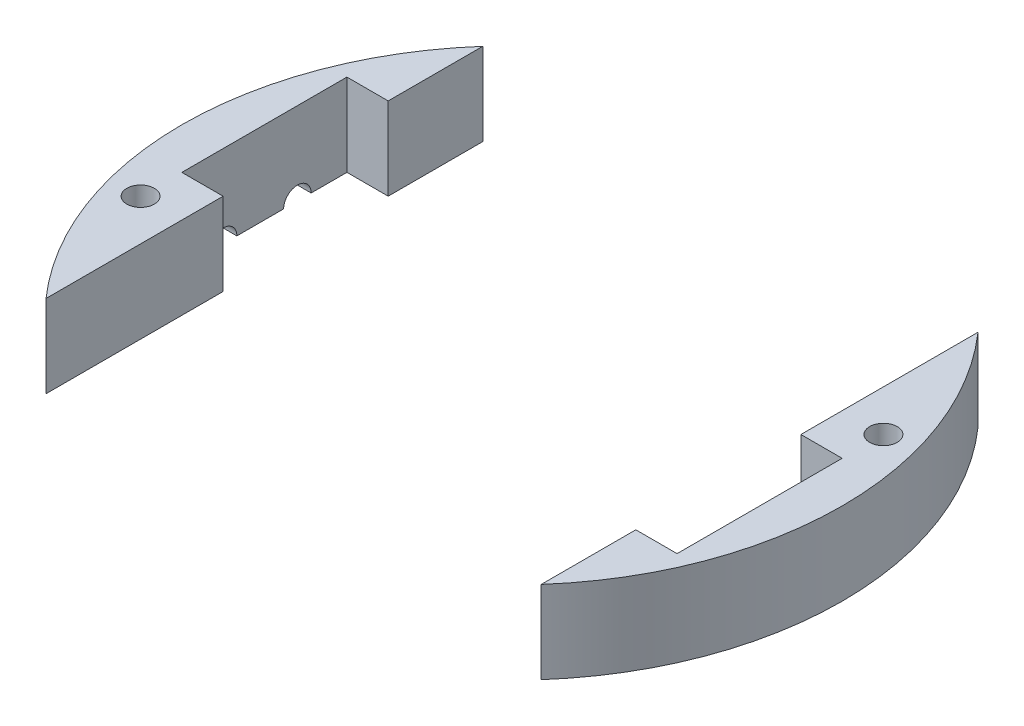
ISO-10303-21;
HEADER;
FILE_DESCRIPTION(('STEP AP214'),'2;1');
FILE_NAME('part.step','',(''),(''),'','','');
FILE_SCHEMA(('AUTOMOTIVE_DESIGN { 1 0 10303 214 1 1 1 1 }'));
ENDSEC;
DATA;
#1=APPLICATION_CONTEXT('core data for automotive mechanical design processes');
#2=APPLICATION_PROTOCOL_DEFINITION('international standard','automotive_design',2000,#1);
#3=PRODUCT_CONTEXT('',#1,'mechanical');
#4=PRODUCT('Part','Part','',(#3));
#5=PRODUCT_RELATED_PRODUCT_CATEGORY('part','',(#4));
#6=PRODUCT_DEFINITION_FORMATION('','',#4);
#7=PRODUCT_DEFINITION_CONTEXT('part definition',#1,'design');
#8=PRODUCT_DEFINITION('design','',#6,#7);
#9=PRODUCT_DEFINITION_SHAPE('','',#8);
#10=(LENGTH_UNIT() NAMED_UNIT(*) SI_UNIT(.MILLI.,.METRE.));
#11=(NAMED_UNIT(*) PLANE_ANGLE_UNIT() SI_UNIT($,.RADIAN.));
#12=(NAMED_UNIT(*) SI_UNIT($,.STERADIAN.) SOLID_ANGLE_UNIT());
#13=UNCERTAINTY_MEASURE_WITH_UNIT(LENGTH_MEASURE(1.E-05),#10,'distance_accuracy_value','');
#14=(GEOMETRIC_REPRESENTATION_CONTEXT(3) GLOBAL_UNCERTAINTY_ASSIGNED_CONTEXT((#13)) GLOBAL_UNIT_ASSIGNED_CONTEXT((#10,
#11,#12)) REPRESENTATION_CONTEXT('',''));
#15=CARTESIAN_POINT('',(0.,0.,0.));
#16=DIRECTION('',(0.,0.,1.));
#17=DIRECTION('',(1.,0.,0.));
#18=AXIS2_PLACEMENT_3D('',#15,#16,#17);
#19=CARTESIAN_POINT('',(45.,15.,22.5));
#20=DIRECTION('',(0.,0.,1.));
#21=DIRECTION('',(1.,0.,0.));
#22=AXIS2_PLACEMENT_3D('',#19,#20,#21);
#23=PLANE('',#22);
#24=DIRECTION('',(-1.,0.,0.));
#25=VECTOR('',#24,1.);
#26=CARTESIAN_POINT('',(45.,0.,22.5));
#27=LINE('',#26,#25);
#28=CARTESIAN_POINT('',(52.5,0.,22.5));
#29=VERTEX_POINT('',#28);
#30=CARTESIAN_POINT('',(45.,0.,22.5));
#31=VERTEX_POINT('',#30);
#32=EDGE_CURVE('E151',#29,#31,#27,.T.);
#33=ORIENTED_EDGE('',*,*,#32,.T.);
#34=DIRECTION('',(0.,-1.,0.));
#35=VECTOR('',#34,1.);
#36=CARTESIAN_POINT('',(45.,15.,22.5));
#37=LINE('',#36,#35);
#38=CARTESIAN_POINT('',(45.,15.,22.5));
#39=VERTEX_POINT('',#38);
#40=EDGE_CURVE('E207',#39,#31,#37,.T.);
#41=ORIENTED_EDGE('',*,*,#40,.F.);
#42=DIRECTION('',(-1.,0.,0.));
#43=VECTOR('',#42,1.);
#44=CARTESIAN_POINT('',(45.,15.,22.5));
#45=LINE('',#44,#43);
#46=CARTESIAN_POINT('',(52.5,15.,22.5));
#47=VERTEX_POINT('',#46);
#48=EDGE_CURVE('E157',#47,#39,#45,.T.);
#49=ORIENTED_EDGE('',*,*,#48,.F.);
#50=DIRECTION('',(0.,-1.,0.));
#51=VECTOR('',#50,1.);
#52=CARTESIAN_POINT('',(52.5,15.,22.5));
#53=LINE('',#52,#51);
#54=EDGE_CURVE('E202',#47,#29,#53,.T.);
#55=ORIENTED_EDGE('',*,*,#54,.T.);
#56=EDGE_LOOP('',(#33,#41,#49,#55));
#57=FACE_BOUND('',#56,.T.);
#58=ADVANCED_FACE('F55',(#57),#23,.F.);
#59=CARTESIAN_POINT('',(45.,15.,22.5));
#60=DIRECTION('',(1.,0.,0.));
#61=DIRECTION('',(0.,0.,-1.));
#62=AXIS2_PLACEMENT_3D('',#59,#60,#61);
#63=PLANE('',#62);
#64=DIRECTION('',(0.,0.,1.));
#65=VECTOR('',#64,1.);
#66=CARTESIAN_POINT('',(45.,0.,22.5));
#67=LINE('',#66,#65);
#68=CARTESIAN_POINT('',(45.,0.,39.6862696659689));
#69=VERTEX_POINT('',#68);
#70=EDGE_CURVE('E174',#31,#69,#67,.T.);
#71=ORIENTED_EDGE('',*,*,#70,.T.);
#72=DIRECTION('',(0.,-1.,0.));
#73=VECTOR('',#72,1.);
#74=CARTESIAN_POINT('',(45.,15.,39.6862696659689));
#75=LINE('',#74,#73);
#76=CARTESIAN_POINT('',(45.,15.,39.6862696659689));
#77=VERTEX_POINT('',#76);
#78=EDGE_CURVE('E210',#77,#69,#75,.T.);
#79=ORIENTED_EDGE('',*,*,#78,.F.);
#80=DIRECTION('',(0.,0.,1.));
#81=VECTOR('',#80,1.);
#82=CARTESIAN_POINT('',(45.,15.,22.5));
#83=LINE('',#82,#81);
#84=EDGE_CURVE('E186',#39,#77,#83,.T.);
#85=ORIENTED_EDGE('',*,*,#84,.F.);
#86=ORIENTED_EDGE('',*,*,#40,.T.);
#87=EDGE_LOOP('',(#71,#79,#85,#86));
#88=FACE_BOUND('',#87,.T.);
#89=ADVANCED_FACE('F233',(#88),#63,.F.);
#90=CARTESIAN_POINT('',(0.,15.,0.));
#91=DIRECTION('',(0.,-1.,0.));
#92=DIRECTION('',(0.,0.,-1.));
#93=AXIS2_PLACEMENT_3D('',#90,#91,#92);
#94=CYLINDRICAL_SURFACE('',#93,60.);
#95=CARTESIAN_POINT('',(0.,0.,0.));
#96=DIRECTION('',(0.,1.,0.));
#97=DIRECTION('',(0.,0.,1.));
#98=AXIS2_PLACEMENT_3D('',#95,#96,#97);
#99=CIRCLE('',#98,60.);
#100=CARTESIAN_POINT('',(45.,0.,-39.6862696659689));
#101=VERTEX_POINT('',#100);
#102=EDGE_CURVE('E170',#69,#101,#99,.T.);
#103=ORIENTED_EDGE('',*,*,#102,.T.);
#104=DIRECTION('',(0.,-1.,0.));
#105=VECTOR('',#104,1.);
#106=CARTESIAN_POINT('',(45.,15.,-39.6862696659689));
#107=LINE('',#106,#105);
#108=CARTESIAN_POINT('',(45.,15.,-39.6862696659689));
#109=VERTEX_POINT('',#108);
#110=EDGE_CURVE('E213',#109,#101,#107,.T.);
#111=ORIENTED_EDGE('',*,*,#110,.F.);
#112=CARTESIAN_POINT('',(0.,15.,0.));
#113=DIRECTION('',(0.,1.,0.));
#114=DIRECTION('',(0.,0.,1.));
#115=AXIS2_PLACEMENT_3D('',#112,#113,#114);
#116=CIRCLE('',#115,60.);
#117=EDGE_CURVE('E184',#77,#109,#116,.T.);
#118=ORIENTED_EDGE('',*,*,#117,.F.);
#119=ORIENTED_EDGE('',*,*,#78,.T.);
#120=EDGE_LOOP('',(#103,#111,#118,#119));
#121=FACE_BOUND('',#120,.T.);
#122=ADVANCED_FACE('F231',(#121),#94,.T.);
#123=CARTESIAN_POINT('',(45.,15.,-7.5));
#124=DIRECTION('',(1.,0.,0.));
#125=DIRECTION('',(0.,0.,-1.));
#126=AXIS2_PLACEMENT_3D('',#123,#124,#125);
#127=PLANE('',#126);
#128=DIRECTION('',(0.,0.,1.));
#129=VECTOR('',#128,1.);
#130=CARTESIAN_POINT('',(45.,0.,-7.5));
#131=LINE('',#130,#129);
#132=CARTESIAN_POINT('',(45.,0.,-7.5));
#133=VERTEX_POINT('',#132);
#134=EDGE_CURVE('E165',#101,#133,#131,.T.);
#135=ORIENTED_EDGE('',*,*,#134,.T.);
#136=DIRECTION('',(0.,-1.,0.));
#137=VECTOR('',#136,1.);
#138=CARTESIAN_POINT('',(45.,15.,-7.5));
#139=LINE('',#138,#137);
#140=CARTESIAN_POINT('',(45.,15.,-7.5));
#141=VERTEX_POINT('',#140);
#142=EDGE_CURVE('E216',#141,#133,#139,.T.);
#143=ORIENTED_EDGE('',*,*,#142,.F.);
#144=DIRECTION('',(0.,0.,1.));
#145=VECTOR('',#144,1.);
#146=CARTESIAN_POINT('',(45.,15.,-7.5));
#147=LINE('',#146,#145);
#148=EDGE_CURVE('E181',#109,#141,#147,.T.);
#149=ORIENTED_EDGE('',*,*,#148,.F.);
#150=ORIENTED_EDGE('',*,*,#110,.T.);
#151=EDGE_LOOP('',(#135,#143,#149,#150));
#152=FACE_BOUND('',#151,.T.);
#153=ADVANCED_FACE('F222',(#152),#127,.F.);
#154=CARTESIAN_POINT('',(45.,15.,-7.5));
#155=DIRECTION('',(0.,0.,-1.));
#156=DIRECTION('',(-1.,0.,0.));
#157=AXIS2_PLACEMENT_3D('',#154,#155,#156);
#158=PLANE('',#157);
#159=DIRECTION('',(1.,0.,0.));
#160=VECTOR('',#159,1.);
#161=CARTESIAN_POINT('',(45.,0.,-7.5));
#162=LINE('',#161,#160);
#163=CARTESIAN_POINT('',(52.5,0.,-7.5));
#164=VERTEX_POINT('',#163);
#165=EDGE_CURVE('E162',#133,#164,#162,.T.);
#166=ORIENTED_EDGE('',*,*,#165,.T.);
#167=DIRECTION('',(0.,-1.,0.));
#168=VECTOR('',#167,1.);
#169=CARTESIAN_POINT('',(52.5,15.,-7.5));
#170=LINE('',#169,#168);
#171=CARTESIAN_POINT('',(52.5,15.,-7.5));
#172=VERTEX_POINT('',#171);
#173=EDGE_CURVE('E182',#172,#164,#170,.T.);
#174=ORIENTED_EDGE('',*,*,#173,.F.);
#175=DIRECTION('',(1.,0.,0.));
#176=VECTOR('',#175,1.);
#177=CARTESIAN_POINT('',(45.,15.,-7.5));
#178=LINE('',#177,#176);
#179=EDGE_CURVE('E178',#141,#172,#178,.T.);
#180=ORIENTED_EDGE('',*,*,#179,.F.);
#181=ORIENTED_EDGE('',*,*,#142,.T.);
#182=EDGE_LOOP('',(#166,#174,#180,#181));
#183=FACE_BOUND('',#182,.T.);
#184=ADVANCED_FACE('F225',(#183),#158,.F.);
#185=CARTESIAN_POINT('',(52.5,15.,-7.5));
#186=DIRECTION('',(1.,0.,0.));
#187=DIRECTION('',(0.,0.,-1.));
#188=AXIS2_PLACEMENT_3D('',#185,#186,#187);
#189=PLANE('',#188);
#190=DIRECTION('',(0.,0.,1.));
#191=VECTOR('',#190,1.);
#192=CARTESIAN_POINT('',(52.5,0.,-7.5));
#193=LINE('',#192,#191);
#194=CARTESIAN_POINT('',(52.5,0.,2.5));
#195=VERTEX_POINT('',#194);
#196=CARTESIAN_POINT('',(52.5,0.,11.));
#197=VERTEX_POINT('',#196);
#198=EDGE_CURVE('E146',#195,#197,#193,.T.);
#199=ORIENTED_EDGE('',*,*,#198,.T.);
#200=CARTESIAN_POINT('',(52.5,0.,13.5));
#201=DIRECTION('',(-1.,0.,0.));
#202=DIRECTION('',(0.,0.,1.));
#203=AXIS2_PLACEMENT_3D('',#200,#201,#202);
#204=CIRCLE('',#203,2.5);
#205=CARTESIAN_POINT('',(52.5,0.,16.));
#206=VERTEX_POINT('',#205);
#207=EDGE_CURVE('E133',#206,#197,#204,.T.);
#208=ORIENTED_EDGE('',*,*,#207,.F.);
#209=EDGE_CURVE('E142',#206,#29,#193,.T.);
#210=ORIENTED_EDGE('',*,*,#209,.T.);
#211=ORIENTED_EDGE('',*,*,#54,.F.);
#212=DIRECTION('',(0.,0.,1.));
#213=VECTOR('',#212,1.);
#214=CARTESIAN_POINT('',(52.5,15.,7.5));
#215=LINE('',#214,#213);
#216=EDGE_CURVE('E153',#172,#47,#215,.T.);
#217=ORIENTED_EDGE('',*,*,#216,.F.);
#218=ORIENTED_EDGE('',*,*,#173,.T.);
#219=CARTESIAN_POINT('',(52.5,0.,-2.5));
#220=VERTEX_POINT('',#219);
#221=EDGE_CURVE('E155',#164,#220,#193,.T.);
#222=ORIENTED_EDGE('',*,*,#221,.T.);
#223=CARTESIAN_POINT('',(52.5,0.,0.));
#224=DIRECTION('',(-1.,0.,0.));
#225=DIRECTION('',(0.,0.,1.));
#226=AXIS2_PLACEMENT_3D('',#223,#224,#225);
#227=CIRCLE('',#226,2.5);
#228=EDGE_CURVE('E200',#195,#220,#227,.T.);
#229=ORIENTED_EDGE('',*,*,#228,.F.);
#230=EDGE_LOOP('',(#199,#208,#210,#211,#217,#218,#222,#229));
#231=FACE_BOUND('',#230,.T.);
#232=ADVANCED_FACE('F140',(#231),#189,.F.);
#233=CARTESIAN_POINT('',(0.,15.,0.));
#234=DIRECTION('',(0.,1.,0.));
#235=DIRECTION('',(0.,0.,1.));
#236=AXIS2_PLACEMENT_3D('',#233,#234,#235);
#237=PLANE('',#236);
#238=CARTESIAN_POINT('',(52.5,15.,-15.));
#239=DIRECTION('',(0.,1.,0.));
#240=DIRECTION('',(0.,0.,1.));
#241=AXIS2_PLACEMENT_3D('',#238,#239,#240);
#242=CIRCLE('',#241,2.5);
#243=CARTESIAN_POINT('',(52.5,15.,-12.5));
#244=VERTEX_POINT('',#243);
#245=EDGE_CURVE('E264',#244,#244,#242,.T.);
#246=ORIENTED_EDGE('',*,*,#245,.F.);
#247=EDGE_LOOP('',(#246));
#248=FACE_BOUND('',#247,.T.);
#249=ORIENTED_EDGE('',*,*,#216,.T.);
#250=ORIENTED_EDGE('',*,*,#48,.T.);
#251=ORIENTED_EDGE('',*,*,#84,.T.);
#252=ORIENTED_EDGE('',*,*,#117,.T.);
#253=ORIENTED_EDGE('',*,*,#148,.T.);
#254=ORIENTED_EDGE('',*,*,#179,.T.);
#255=EDGE_LOOP('',(#249,#250,#251,#252,#253,#254));
#256=FACE_BOUND('',#255,.T.);
#257=ADVANCED_FACE('F57',(#248,#256),#237,.T.);
#258=CARTESIAN_POINT('',(0.,0.,0.));
#259=DIRECTION('',(0.,1.,0.));
#260=DIRECTION('',(0.,0.,1.));
#261=AXIS2_PLACEMENT_3D('',#258,#259,#260);
#262=PLANE('',#261);
#263=CARTESIAN_POINT('',(52.5,0.,-15.));
#264=DIRECTION('',(0.,1.,0.));
#265=DIRECTION('',(0.,0.,1.));
#266=AXIS2_PLACEMENT_3D('',#263,#264,#265);
#267=CIRCLE('',#266,2.5);
#268=CARTESIAN_POINT('',(52.5,0.,-12.5));
#269=VERTEX_POINT('',#268);
#270=EDGE_CURVE('E147',#269,#269,#267,.T.);
#271=ORIENTED_EDGE('',*,*,#270,.T.);
#272=EDGE_LOOP('',(#271));
#273=FACE_BOUND('',#272,.T.);
#274=DIRECTION('',(0.,0.,1.));
#275=VECTOR('',#274,1.);
#276=CARTESIAN_POINT('',(55.,0.,0.));
#277=LINE('',#276,#275);
#278=CARTESIAN_POINT('',(55.,0.,11.));
#279=VERTEX_POINT('',#278);
#280=CARTESIAN_POINT('',(55.,0.,16.));
#281=VERTEX_POINT('',#280);
#282=EDGE_CURVE('E137',#279,#281,#277,.T.);
#283=ORIENTED_EDGE('',*,*,#282,.F.);
#284=DIRECTION('',(-1.,0.,0.));
#285=VECTOR('',#284,1.);
#286=CARTESIAN_POINT('',(55.,0.,11.));
#287=LINE('',#286,#285);
#288=EDGE_CURVE('E12',#279,#197,#287,.T.);
#289=ORIENTED_EDGE('',*,*,#288,.T.);
#290=ORIENTED_EDGE('',*,*,#198,.F.);
#291=DIRECTION('',(-1.,0.,0.));
#292=VECTOR('',#291,1.);
#293=CARTESIAN_POINT('',(58.,0.,2.5));
#294=LINE('',#293,#292);
#295=CARTESIAN_POINT('',(58.,0.,2.5));
#296=VERTEX_POINT('',#295);
#297=EDGE_CURVE('E190',#195,#296,#294,.F.);
#298=ORIENTED_EDGE('',*,*,#297,.T.);
#299=DIRECTION('',(0.,0.,1.));
#300=VECTOR('',#299,1.);
#301=CARTESIAN_POINT('',(58.,0.,0.));
#302=LINE('',#301,#300);
#303=CARTESIAN_POINT('',(58.,0.,-2.5));
#304=VERTEX_POINT('',#303);
#305=EDGE_CURVE('E177',#304,#296,#302,.T.);
#306=ORIENTED_EDGE('',*,*,#305,.F.);
#307=DIRECTION('',(-1.,0.,0.));
#308=VECTOR('',#307,1.);
#309=CARTESIAN_POINT('',(58.,0.,-2.5));
#310=LINE('',#309,#308);
#311=EDGE_CURVE('E193',#304,#220,#310,.T.);
#312=ORIENTED_EDGE('',*,*,#311,.T.);
#313=ORIENTED_EDGE('',*,*,#221,.F.);
#314=ORIENTED_EDGE('',*,*,#165,.F.);
#315=ORIENTED_EDGE('',*,*,#134,.F.);
#316=ORIENTED_EDGE('',*,*,#102,.F.);
#317=ORIENTED_EDGE('',*,*,#70,.F.);
#318=ORIENTED_EDGE('',*,*,#32,.F.);
#319=ORIENTED_EDGE('',*,*,#209,.F.);
#320=DIRECTION('',(-1.,0.,0.));
#321=VECTOR('',#320,1.);
#322=CARTESIAN_POINT('',(55.,0.,16.));
#323=LINE('',#322,#321);
#324=EDGE_CURVE('E63',#206,#281,#323,.F.);
#325=ORIENTED_EDGE('',*,*,#324,.T.);
#326=EDGE_LOOP('',(#283,#289,#290,#298,#306,#312,#313,#314,#315,#316,#317,#318,#319,#325));
#327=FACE_BOUND('',#326,.T.);
#328=ADVANCED_FACE('F149',(#273,#327),#262,.F.);
#329=CARTESIAN_POINT('',(58.,0.,0.));
#330=DIRECTION('',(-1.,0.,0.));
#331=DIRECTION('',(0.,0.,1.));
#332=AXIS2_PLACEMENT_3D('',#329,#330,#331);
#333=CYLINDRICAL_SURFACE('',#332,2.5);
#334=CARTESIAN_POINT('',(58.,0.,0.));
#335=DIRECTION('',(-1.,0.,0.));
#336=DIRECTION('',(0.,0.,1.));
#337=AXIS2_PLACEMENT_3D('',#334,#335,#336);
#338=CIRCLE('',#337,2.5);
#339=EDGE_CURVE('E76',#296,#304,#338,.T.);
#340=ORIENTED_EDGE('',*,*,#339,.F.);
#341=ORIENTED_EDGE('',*,*,#297,.F.);
#342=ORIENTED_EDGE('',*,*,#228,.T.);
#343=ORIENTED_EDGE('',*,*,#311,.F.);
#344=EDGE_LOOP('',(#340,#341,#342,#343));
#345=FACE_BOUND('',#344,.T.);
#346=ADVANCED_FACE('F199',(#345),#333,.F.);
#347=CARTESIAN_POINT('',(58.,0.,0.));
#348=DIRECTION('',(-1.,0.,0.));
#349=DIRECTION('',(0.,0.,1.));
#350=AXIS2_PLACEMENT_3D('',#347,#348,#349);
#351=PLANE('',#350);
#352=ORIENTED_EDGE('',*,*,#305,.T.);
#353=ORIENTED_EDGE('',*,*,#339,.T.);
#354=EDGE_LOOP('',(#352,#353));
#355=FACE_BOUND('',#354,.T.);
#356=ADVANCED_FACE('F259',(#355),#351,.T.);
#357=CARTESIAN_POINT('',(55.,0.,13.5));
#358=DIRECTION('',(-1.,0.,0.));
#359=DIRECTION('',(0.,0.,1.));
#360=AXIS2_PLACEMENT_3D('',#357,#358,#359);
#361=CYLINDRICAL_SURFACE('',#360,2.5);
#362=CARTESIAN_POINT('',(55.,0.,13.5));
#363=DIRECTION('',(-1.,0.,0.));
#364=DIRECTION('',(0.,0.,1.));
#365=AXIS2_PLACEMENT_3D('',#362,#363,#364);
#366=CIRCLE('',#365,2.5);
#367=EDGE_CURVE('E69',#281,#279,#366,.T.);
#368=ORIENTED_EDGE('',*,*,#367,.F.);
#369=ORIENTED_EDGE('',*,*,#324,.F.);
#370=ORIENTED_EDGE('',*,*,#207,.T.);
#371=ORIENTED_EDGE('',*,*,#288,.F.);
#372=EDGE_LOOP('',(#368,#369,#370,#371));
#373=FACE_BOUND('',#372,.T.);
#374=ADVANCED_FACE('F132',(#373),#361,.F.);
#375=CARTESIAN_POINT('',(55.,0.,13.5));
#376=DIRECTION('',(-1.,0.,0.));
#377=DIRECTION('',(0.,0.,1.));
#378=AXIS2_PLACEMENT_3D('',#375,#376,#377);
#379=PLANE('',#378);
#380=ORIENTED_EDGE('',*,*,#282,.T.);
#381=ORIENTED_EDGE('',*,*,#367,.T.);
#382=EDGE_LOOP('',(#380,#381));
#383=FACE_BOUND('',#382,.T.);
#384=ADVANCED_FACE('F196',(#383),#379,.T.);
#385=CARTESIAN_POINT('',(52.5,0.,-15.));
#386=DIRECTION('',(0.,1.,0.));
#387=DIRECTION('',(0.,0.,1.));
#388=AXIS2_PLACEMENT_3D('',#385,#386,#387);
#389=CYLINDRICAL_SURFACE('',#388,2.5);
#390=ORIENTED_EDGE('',*,*,#270,.F.);
#391=EDGE_LOOP('',(#390));
#392=FACE_BOUND('',#391,.T.);
#393=ORIENTED_EDGE('',*,*,#245,.T.);
#394=EDGE_LOOP('',(#393));
#395=FACE_BOUND('',#394,.T.);
#396=ADVANCED_FACE('F270',(#392,#395),#389,.F.);
#397=CLOSED_SHELL('',(#58,#89,#122,#153,#184,#232,#257,#328,#346,#356,#374,#384,#396));
#398=MANIFOLD_SOLID_BREP('B2',#397);
#399=CARTESIAN_POINT('',(-52.5,15.,-22.5));
#400=DIRECTION('',(0.,0.,-1.));
#401=DIRECTION('',(-1.,0.,0.));
#402=AXIS2_PLACEMENT_3D('',#399,#400,#401);
#403=PLANE('',#402);
#404=DIRECTION('',(1.,0.,0.));
#405=VECTOR('',#404,1.);
#406=CARTESIAN_POINT('',(-52.5,0.,-22.5));
#407=LINE('',#406,#405);
#408=CARTESIAN_POINT('',(-52.5,0.,-22.5));
#409=VERTEX_POINT('',#408);
#410=CARTESIAN_POINT('',(-45.,0.,-22.5));
#411=VERTEX_POINT('',#410);
#412=EDGE_CURVE('E519',#409,#411,#407,.T.);
#413=ORIENTED_EDGE('',*,*,#412,.T.);
#414=DIRECTION('',(0.,-1.,0.));
#415=VECTOR('',#414,1.);
#416=CARTESIAN_POINT('',(-45.,15.,-22.5));
#417=LINE('',#416,#415);
#418=CARTESIAN_POINT('',(-45.,15.,-22.5));
#419=VERTEX_POINT('',#418);
#420=EDGE_CURVE('E483',#419,#411,#417,.T.);
#421=ORIENTED_EDGE('',*,*,#420,.F.);
#422=DIRECTION('',(1.,0.,0.));
#423=VECTOR('',#422,1.);
#424=CARTESIAN_POINT('',(-52.5,15.,-22.5));
#425=LINE('',#424,#423);
#426=CARTESIAN_POINT('',(-52.5,15.,-22.5));
#427=VERTEX_POINT('',#426);
#428=EDGE_CURVE('E534',#427,#419,#425,.T.);
#429=ORIENTED_EDGE('',*,*,#428,.F.);
#430=DIRECTION('',(0.,-1.,0.));
#431=VECTOR('',#430,1.);
#432=CARTESIAN_POINT('',(-52.5,15.,-22.5));
#433=LINE('',#432,#431);
#434=EDGE_CURVE('E487',#427,#409,#433,.T.);
#435=ORIENTED_EDGE('',*,*,#434,.T.);
#436=EDGE_LOOP('',(#413,#421,#429,#435));
#437=FACE_BOUND('',#436,.T.);
#438=ADVANCED_FACE('F357',(#437),#403,.F.);
#439=CARTESIAN_POINT('',(-45.,15.,-22.5));
#440=DIRECTION('',(-1.,0.,0.));
#441=DIRECTION('',(0.,0.,1.));
#442=AXIS2_PLACEMENT_3D('',#439,#440,#441);
#443=PLANE('',#442);
#444=DIRECTION('',(0.,0.,-1.));
#445=VECTOR('',#444,1.);
#446=CARTESIAN_POINT('',(-45.,0.,-22.5));
#447=LINE('',#446,#445);
#448=CARTESIAN_POINT('',(-45.,0.,-39.6862696659689));
#449=VERTEX_POINT('',#448);
#450=EDGE_CURVE('E514',#411,#449,#447,.T.);
#451=ORIENTED_EDGE('',*,*,#450,.T.);
#452=DIRECTION('',(0.,-1.,0.));
#453=VECTOR('',#452,1.);
#454=CARTESIAN_POINT('',(-45.,15.,-39.6862696659689));
#455=LINE('',#454,#453);
#456=CARTESIAN_POINT('',(-45.,15.,-39.6862696659689));
#457=VERTEX_POINT('',#456);
#458=EDGE_CURVE('E479',#457,#449,#455,.T.);
#459=ORIENTED_EDGE('',*,*,#458,.F.);
#460=DIRECTION('',(0.,0.,-1.));
#461=VECTOR('',#460,1.);
#462=CARTESIAN_POINT('',(-45.,15.,-22.5));
#463=LINE('',#462,#461);
#464=EDGE_CURVE('E531',#419,#457,#463,.T.);
#465=ORIENTED_EDGE('',*,*,#464,.F.);
#466=ORIENTED_EDGE('',*,*,#420,.T.);
#467=EDGE_LOOP('',(#451,#459,#465,#466));
#468=FACE_BOUND('',#467,.T.);
#469=ADVANCED_FACE('F571',(#468),#443,.F.);
#470=CARTESIAN_POINT('',(0.,15.,0.));
#471=DIRECTION('',(0.,-1.,0.));
#472=DIRECTION('',(0.,0.,-1.));
#473=AXIS2_PLACEMENT_3D('',#470,#471,#472);
#474=CYLINDRICAL_SURFACE('',#473,60.);
#475=CARTESIAN_POINT('',(0.,0.,0.));
#476=DIRECTION('',(0.,1.,0.));
#477=DIRECTION('',(0.,0.,1.));
#478=AXIS2_PLACEMENT_3D('',#475,#476,#477);
#479=CIRCLE('',#478,60.);
#480=CARTESIAN_POINT('',(-45.,0.,39.6862696659689));
#481=VERTEX_POINT('',#480);
#482=EDGE_CURVE('E510',#449,#481,#479,.T.);
#483=ORIENTED_EDGE('',*,*,#482,.T.);
#484=DIRECTION('',(0.,-1.,0.));
#485=VECTOR('',#484,1.);
#486=CARTESIAN_POINT('',(-45.,15.,39.6862696659689));
#487=LINE('',#486,#485);
#488=CARTESIAN_POINT('',(-45.,15.,39.6862696659689));
#489=VERTEX_POINT('',#488);
#490=EDGE_CURVE('E475',#489,#481,#487,.T.);
#491=ORIENTED_EDGE('',*,*,#490,.F.);
#492=CARTESIAN_POINT('',(0.,15.,0.));
#493=DIRECTION('',(0.,1.,0.));
#494=DIRECTION('',(0.,0.,1.));
#495=AXIS2_PLACEMENT_3D('',#492,#493,#494);
#496=CIRCLE('',#495,60.);
#497=EDGE_CURVE('E528',#457,#489,#496,.T.);
#498=ORIENTED_EDGE('',*,*,#497,.F.);
#499=ORIENTED_EDGE('',*,*,#458,.T.);
#500=EDGE_LOOP('',(#483,#491,#498,#499));
#501=FACE_BOUND('',#500,.T.);
#502=ADVANCED_FACE('F576',(#501),#474,.T.);
#503=CARTESIAN_POINT('',(-45.,15.,7.5));
#504=DIRECTION('',(-1.,0.,0.));
#505=DIRECTION('',(0.,0.,1.));
#506=AXIS2_PLACEMENT_3D('',#503,#504,#505);
#507=PLANE('',#506);
#508=DIRECTION('',(0.,0.,-1.));
#509=VECTOR('',#508,1.);
#510=CARTESIAN_POINT('',(-45.,0.,7.5));
#511=LINE('',#510,#509);
#512=CARTESIAN_POINT('',(-45.,0.,7.5));
#513=VERTEX_POINT('',#512);
#514=EDGE_CURVE('E505',#481,#513,#511,.T.);
#515=ORIENTED_EDGE('',*,*,#514,.T.);
#516=DIRECTION('',(0.,-1.,0.));
#517=VECTOR('',#516,1.);
#518=CARTESIAN_POINT('',(-45.,15.,7.5));
#519=LINE('',#518,#517);
#520=CARTESIAN_POINT('',(-45.,15.,7.5));
#521=VERTEX_POINT('',#520);
#522=EDGE_CURVE('E470',#521,#513,#519,.T.);
#523=ORIENTED_EDGE('',*,*,#522,.F.);
#524=DIRECTION('',(0.,0.,-1.));
#525=VECTOR('',#524,1.);
#526=CARTESIAN_POINT('',(-45.,15.,7.5));
#527=LINE('',#526,#525);
#528=EDGE_CURVE('E525',#489,#521,#527,.T.);
#529=ORIENTED_EDGE('',*,*,#528,.F.);
#530=ORIENTED_EDGE('',*,*,#490,.T.);
#531=EDGE_LOOP('',(#515,#523,#529,#530));
#532=FACE_BOUND('',#531,.T.);
#533=ADVANCED_FACE('F577',(#532),#507,.F.);
#534=CARTESIAN_POINT('',(-52.5,15.,7.5));
#535=DIRECTION('',(0.,0.,1.));
#536=DIRECTION('',(1.,0.,0.));
#537=AXIS2_PLACEMENT_3D('',#534,#535,#536);
#538=PLANE('',#537);
#539=DIRECTION('',(-1.,0.,0.));
#540=VECTOR('',#539,1.);
#541=CARTESIAN_POINT('',(-52.5,0.,7.5));
#542=LINE('',#541,#540);
#543=CARTESIAN_POINT('',(-52.5,0.,7.5));
#544=VERTEX_POINT('',#543);
#545=EDGE_CURVE('E463',#513,#544,#542,.T.);
#546=ORIENTED_EDGE('',*,*,#545,.T.);
#547=DIRECTION('',(0.,-1.,0.));
#548=VECTOR('',#547,1.);
#549=CARTESIAN_POINT('',(-52.5,15.,7.5));
#550=LINE('',#549,#548);
#551=CARTESIAN_POINT('',(-52.5,15.,7.5));
#552=VERTEX_POINT('',#551);
#553=EDGE_CURVE('E467',#552,#544,#550,.T.);
#554=ORIENTED_EDGE('',*,*,#553,.F.);
#555=DIRECTION('',(-1.,0.,0.));
#556=VECTOR('',#555,1.);
#557=CARTESIAN_POINT('',(-52.5,15.,7.5));
#558=LINE('',#557,#556);
#559=EDGE_CURVE('E471',#521,#552,#558,.T.);
#560=ORIENTED_EDGE('',*,*,#559,.F.);
#561=ORIENTED_EDGE('',*,*,#522,.T.);
#562=EDGE_LOOP('',(#546,#554,#560,#561));
#563=FACE_BOUND('',#562,.T.);
#564=ADVANCED_FACE('F578',(#563),#538,.F.);
#565=CARTESIAN_POINT('',(-52.5,15.,-7.5));
#566=DIRECTION('',(-1.,0.,0.));
#567=DIRECTION('',(0.,0.,1.));
#568=AXIS2_PLACEMENT_3D('',#565,#566,#567);
#569=PLANE('',#568);
#570=DIRECTION('',(0.,0.,-1.));
#571=VECTOR('',#570,1.);
#572=CARTESIAN_POINT('',(-52.5,0.,-7.5));
#573=LINE('',#572,#571);
#574=CARTESIAN_POINT('',(-52.5,0.,2.5));
#575=VERTEX_POINT('',#574);
#576=EDGE_CURVE('E449',#544,#575,#573,.T.);
#577=ORIENTED_EDGE('',*,*,#576,.T.);
#578=CARTESIAN_POINT('',(-52.5,0.,0.));
#579=DIRECTION('',(1.,0.,0.));
#580=DIRECTION('',(0.,0.,-1.));
#581=AXIS2_PLACEMENT_3D('',#578,#579,#580);
#582=CIRCLE('',#581,2.5);
#583=CARTESIAN_POINT('',(-52.5,0.,-2.5));
#584=VERTEX_POINT('',#583);
#585=EDGE_CURVE('E435',#584,#575,#582,.T.);
#586=ORIENTED_EDGE('',*,*,#585,.F.);
#587=CARTESIAN_POINT('',(-52.5,0.,-11.));
#588=VERTEX_POINT('',#587);
#589=EDGE_CURVE('E445',#584,#588,#573,.T.);
#590=ORIENTED_EDGE('',*,*,#589,.T.);
#591=CARTESIAN_POINT('',(-52.5,0.,-13.5));
#592=DIRECTION('',(1.,0.,0.));
#593=DIRECTION('',(0.,0.,-1.));
#594=AXIS2_PLACEMENT_3D('',#591,#592,#593);
#595=CIRCLE('',#594,2.5);
#596=CARTESIAN_POINT('',(-52.5,0.,-16.));
#597=VERTEX_POINT('',#596);
#598=EDGE_CURVE('E540',#597,#588,#595,.T.);
#599=ORIENTED_EDGE('',*,*,#598,.F.);
#600=EDGE_CURVE('E458',#597,#409,#573,.T.);
#601=ORIENTED_EDGE('',*,*,#600,.T.);
#602=ORIENTED_EDGE('',*,*,#434,.F.);
#603=DIRECTION('',(0.,0.,-1.));
#604=VECTOR('',#603,1.);
#605=CARTESIAN_POINT('',(-52.5,15.,-7.5));
#606=LINE('',#605,#604);
#607=EDGE_CURVE('E462',#552,#427,#606,.T.);
#608=ORIENTED_EDGE('',*,*,#607,.F.);
#609=ORIENTED_EDGE('',*,*,#553,.T.);
#610=EDGE_LOOP('',(#577,#586,#590,#599,#601,#602,#608,#609));
#611=FACE_BOUND('',#610,.T.);
#612=ADVANCED_FACE('F443',(#611),#569,.F.);
#613=CARTESIAN_POINT('',(0.,15.,0.));
#614=DIRECTION('',(0.,1.,0.));
#615=DIRECTION('',(0.,0.,1.));
#616=AXIS2_PLACEMENT_3D('',#613,#614,#615);
#617=PLANE('',#616);
#618=CARTESIAN_POINT('',(-52.5,15.,15.));
#619=DIRECTION('',(0.,1.,0.));
#620=DIRECTION('',(0.,0.,1.));
#621=AXIS2_PLACEMENT_3D('',#618,#619,#620);
#622=CIRCLE('',#621,2.5);
#623=CARTESIAN_POINT('',(-52.5,15.,17.5));
#624=VERTEX_POINT('',#623);
#625=EDGE_CURVE('E451',#624,#624,#622,.T.);
#626=ORIENTED_EDGE('',*,*,#625,.F.);
#627=EDGE_LOOP('',(#626));
#628=FACE_BOUND('',#627,.T.);
#629=ORIENTED_EDGE('',*,*,#607,.T.);
#630=ORIENTED_EDGE('',*,*,#428,.T.);
#631=ORIENTED_EDGE('',*,*,#464,.T.);
#632=ORIENTED_EDGE('',*,*,#497,.T.);
#633=ORIENTED_EDGE('',*,*,#528,.T.);
#634=ORIENTED_EDGE('',*,*,#559,.T.);
#635=EDGE_LOOP('',(#629,#630,#631,#632,#633,#634));
#636=FACE_BOUND('',#635,.T.);
#637=ADVANCED_FACE('F557',(#628,#636),#617,.T.);
#638=CARTESIAN_POINT('',(0.,0.,0.));
#639=DIRECTION('',(0.,1.,0.));
#640=DIRECTION('',(0.,0.,1.));
#641=AXIS2_PLACEMENT_3D('',#638,#639,#640);
#642=PLANE('',#641);
#643=CARTESIAN_POINT('',(-52.5,0.,15.));
#644=DIRECTION('',(0.,1.,0.));
#645=DIRECTION('',(0.,0.,1.));
#646=AXIS2_PLACEMENT_3D('',#643,#644,#645);
#647=CIRCLE('',#646,2.5);
#648=CARTESIAN_POINT('',(-52.5,0.,17.5));
#649=VERTEX_POINT('',#648);
#650=EDGE_CURVE('E547',#649,#649,#647,.T.);
#651=ORIENTED_EDGE('',*,*,#650,.T.);
#652=EDGE_LOOP('',(#651));
#653=FACE_BOUND('',#652,.T.);
#654=DIRECTION('',(0.,0.,-1.));
#655=VECTOR('',#654,1.);
#656=CARTESIAN_POINT('',(-58.,0.,0.));
#657=LINE('',#656,#655);
#658=CARTESIAN_POINT('',(-58.,0.,2.5));
#659=VERTEX_POINT('',#658);
#660=CARTESIAN_POINT('',(-58.,0.,-2.5));
#661=VERTEX_POINT('',#660);
#662=EDGE_CURVE('E440',#659,#661,#657,.T.);
#663=ORIENTED_EDGE('',*,*,#662,.F.);
#664=DIRECTION('',(1.,0.,0.));
#665=VECTOR('',#664,1.);
#666=CARTESIAN_POINT('',(-58.,0.,2.5));
#667=LINE('',#666,#665);
#668=EDGE_CURVE('E53',#659,#575,#667,.T.);
#669=ORIENTED_EDGE('',*,*,#668,.T.);
#670=ORIENTED_EDGE('',*,*,#576,.F.);
#671=ORIENTED_EDGE('',*,*,#545,.F.);
#672=ORIENTED_EDGE('',*,*,#514,.F.);
#673=ORIENTED_EDGE('',*,*,#482,.F.);
#674=ORIENTED_EDGE('',*,*,#450,.F.);
#675=ORIENTED_EDGE('',*,*,#412,.F.);
#676=ORIENTED_EDGE('',*,*,#600,.F.);
#677=DIRECTION('',(1.,0.,0.));
#678=VECTOR('',#677,1.);
#679=CARTESIAN_POINT('',(-55.,0.,-16.));
#680=LINE('',#679,#678);
#681=CARTESIAN_POINT('',(-55.,0.,-16.));
#682=VERTEX_POINT('',#681);
#683=EDGE_CURVE('E494',#597,#682,#680,.F.);
#684=ORIENTED_EDGE('',*,*,#683,.T.);
#685=DIRECTION('',(0.,0.,-1.));
#686=VECTOR('',#685,1.);
#687=CARTESIAN_POINT('',(-55.,0.,0.));
#688=LINE('',#687,#686);
#689=CARTESIAN_POINT('',(-55.,0.,-11.));
#690=VERTEX_POINT('',#689);
#691=EDGE_CURVE('E491',#690,#682,#688,.T.);
#692=ORIENTED_EDGE('',*,*,#691,.F.);
#693=DIRECTION('',(1.,0.,0.));
#694=VECTOR('',#693,1.);
#695=CARTESIAN_POINT('',(-55.,0.,-11.));
#696=LINE('',#695,#694);
#697=EDGE_CURVE('E456',#690,#588,#696,.T.);
#698=ORIENTED_EDGE('',*,*,#697,.T.);
#699=ORIENTED_EDGE('',*,*,#589,.F.);
#700=DIRECTION('',(1.,0.,0.));
#701=VECTOR('',#700,1.);
#702=CARTESIAN_POINT('',(-58.,0.,-2.5));
#703=LINE('',#702,#701);
#704=EDGE_CURVE('E365',#584,#661,#703,.F.);
#705=ORIENTED_EDGE('',*,*,#704,.T.);
#706=EDGE_LOOP('',(#663,#669,#670,#671,#672,#673,#674,#675,#676,#684,#692,#698,#699,#705));
#707=FACE_BOUND('',#706,.T.);
#708=ADVANCED_FACE('F454',(#653,#707),#642,.F.);
#709=CARTESIAN_POINT('',(-55.,0.,-13.5));
#710=DIRECTION('',(1.,0.,0.));
#711=DIRECTION('',(0.,0.,-1.));
#712=AXIS2_PLACEMENT_3D('',#709,#710,#711);
#713=CYLINDRICAL_SURFACE('',#712,2.5);
#714=CARTESIAN_POINT('',(-55.,0.,-13.5));
#715=DIRECTION('',(1.,0.,0.));
#716=DIRECTION('',(0.,0.,-1.));
#717=AXIS2_PLACEMENT_3D('',#714,#715,#716);
#718=CIRCLE('',#717,2.5);
#719=EDGE_CURVE('E378',#682,#690,#718,.T.);
#720=ORIENTED_EDGE('',*,*,#719,.F.);
#721=ORIENTED_EDGE('',*,*,#683,.F.);
#722=ORIENTED_EDGE('',*,*,#598,.T.);
#723=ORIENTED_EDGE('',*,*,#697,.F.);
#724=EDGE_LOOP('',(#720,#721,#722,#723));
#725=FACE_BOUND('',#724,.T.);
#726=ADVANCED_FACE('F635',(#725),#713,.F.);
#727=CARTESIAN_POINT('',(-55.,0.,-13.5));
#728=DIRECTION('',(1.,0.,0.));
#729=DIRECTION('',(0.,0.,-1.));
#730=AXIS2_PLACEMENT_3D('',#727,#728,#729);
#731=PLANE('',#730);
#732=ORIENTED_EDGE('',*,*,#691,.T.);
#733=ORIENTED_EDGE('',*,*,#719,.T.);
#734=EDGE_LOOP('',(#732,#733));
#735=FACE_BOUND('',#734,.T.);
#736=ADVANCED_FACE('F645',(#735),#731,.T.);
#737=CARTESIAN_POINT('',(-58.,0.,0.));
#738=DIRECTION('',(1.,0.,0.));
#739=DIRECTION('',(0.,0.,-1.));
#740=AXIS2_PLACEMENT_3D('',#737,#738,#739);
#741=CYLINDRICAL_SURFACE('',#740,2.5);
#742=CARTESIAN_POINT('',(-58.,0.,0.));
#743=DIRECTION('',(1.,0.,0.));
#744=DIRECTION('',(0.,0.,-1.));
#745=AXIS2_PLACEMENT_3D('',#742,#743,#744);
#746=CIRCLE('',#745,2.5);
#747=EDGE_CURVE('E371',#661,#659,#746,.T.);
#748=ORIENTED_EDGE('',*,*,#747,.F.);
#749=ORIENTED_EDGE('',*,*,#704,.F.);
#750=ORIENTED_EDGE('',*,*,#585,.T.);
#751=ORIENTED_EDGE('',*,*,#668,.F.);
#752=EDGE_LOOP('',(#748,#749,#750,#751));
#753=FACE_BOUND('',#752,.T.);
#754=ADVANCED_FACE('F434',(#753),#741,.F.);
#755=CARTESIAN_POINT('',(-58.,0.,0.));
#756=DIRECTION('',(1.,0.,0.));
#757=DIRECTION('',(0.,0.,-1.));
#758=AXIS2_PLACEMENT_3D('',#755,#756,#757);
#759=PLANE('',#758);
#760=ORIENTED_EDGE('',*,*,#662,.T.);
#761=ORIENTED_EDGE('',*,*,#747,.T.);
#762=EDGE_LOOP('',(#760,#761));
#763=FACE_BOUND('',#762,.T.);
#764=ADVANCED_FACE('F501',(#763),#759,.T.);
#765=CARTESIAN_POINT('',(-52.5,0.,15.));
#766=DIRECTION('',(0.,1.,0.));
#767=DIRECTION('',(0.,0.,1.));
#768=AXIS2_PLACEMENT_3D('',#765,#766,#767);
#769=CYLINDRICAL_SURFACE('',#768,2.5);
#770=ORIENTED_EDGE('',*,*,#650,.F.);
#771=EDGE_LOOP('',(#770));
#772=FACE_BOUND('',#771,.T.);
#773=ORIENTED_EDGE('',*,*,#625,.T.);
#774=EDGE_LOOP('',(#773));
#775=FACE_BOUND('',#774,.T.);
#776=ADVANCED_FACE('F555',(#772,#775),#769,.F.);
#777=CLOSED_SHELL('',(#438,#469,#502,#533,#564,#612,#637,#708,#726,#736,#754,#764,#776));
#778=MANIFOLD_SOLID_BREP('B6',#777);
#779=ADVANCED_BREP_SHAPE_REPRESENTATION('',(#18,#398,#778),#14);
#780=SHAPE_DEFINITION_REPRESENTATION(#9,#779);
ENDSEC;
END-ISO-10303-21;
